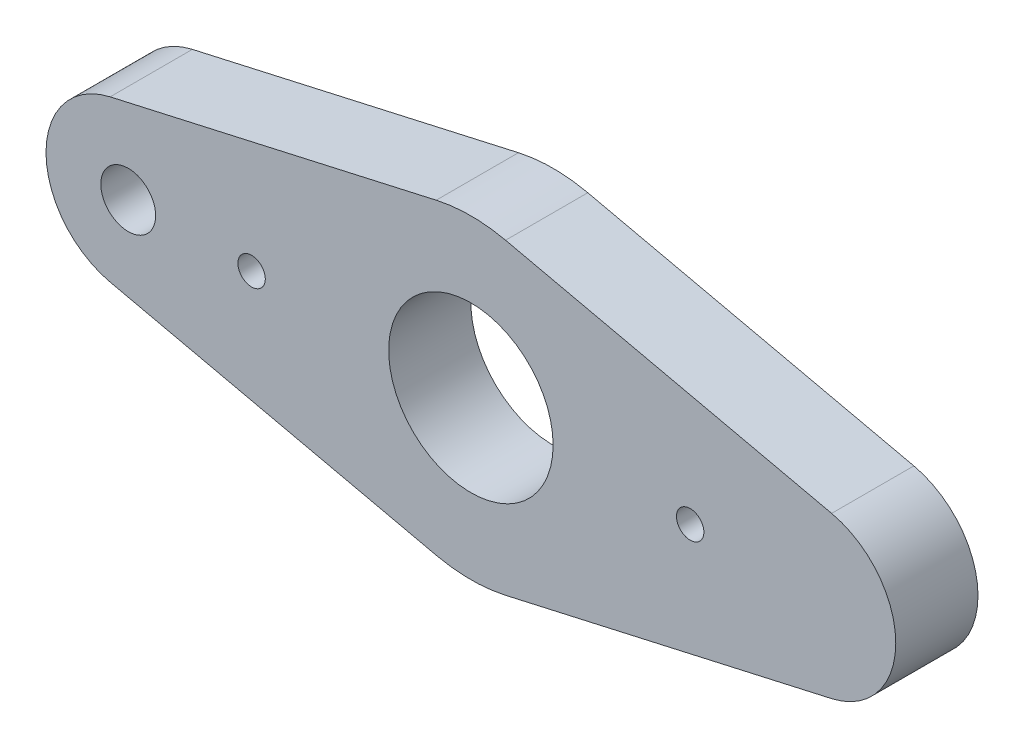
ISO-10303-21;
HEADER;
FILE_DESCRIPTION(('STEP AP214'),'2;1');
FILE_NAME('part.step','',(''),(''),'','','');
FILE_SCHEMA(('AUTOMOTIVE_DESIGN { 1 0 10303 214 1 1 1 1 }'));
ENDSEC;
DATA;
#1=APPLICATION_CONTEXT('core data for automotive mechanical design processes');
#2=APPLICATION_PROTOCOL_DEFINITION('international standard','automotive_design',2000,#1);
#3=PRODUCT_CONTEXT('',#1,'mechanical');
#4=PRODUCT('Part','Part','',(#3));
#5=PRODUCT_RELATED_PRODUCT_CATEGORY('part','',(#4));
#6=PRODUCT_DEFINITION_FORMATION('','',#4);
#7=PRODUCT_DEFINITION_CONTEXT('part definition',#1,'design');
#8=PRODUCT_DEFINITION('design','',#6,#7);
#9=PRODUCT_DEFINITION_SHAPE('','',#8);
#10=(LENGTH_UNIT() NAMED_UNIT(*) SI_UNIT(.MILLI.,.METRE.));
#11=(NAMED_UNIT(*) PLANE_ANGLE_UNIT() SI_UNIT($,.RADIAN.));
#12=(NAMED_UNIT(*) SI_UNIT($,.STERADIAN.) SOLID_ANGLE_UNIT());
#13=UNCERTAINTY_MEASURE_WITH_UNIT(LENGTH_MEASURE(1.E-05),#10,'distance_accuracy_value','');
#14=(GEOMETRIC_REPRESENTATION_CONTEXT(3) GLOBAL_UNCERTAINTY_ASSIGNED_CONTEXT((#13)) GLOBAL_UNIT_ASSIGNED_CONTEXT((#10,
#11,#12)) REPRESENTATION_CONTEXT('',''));
#15=CARTESIAN_POINT('',(0.,0.,0.));
#16=DIRECTION('',(0.,0.,1.));
#17=DIRECTION('',(1.,0.,0.));
#18=AXIS2_PLACEMENT_3D('',#15,#16,#17);
#19=CARTESIAN_POINT('',(-25.,0.,6.));
#20=DIRECTION('',(0.,0.,1.));
#21=DIRECTION('',(1.,0.,0.));
#22=AXIS2_PLACEMENT_3D('',#19,#20,#21);
#23=PLANE('',#22);
#24=CARTESIAN_POINT('',(-25.,0.,6.));
#25=DIRECTION('',(0.,0.,1.));
#26=DIRECTION('',(1.,0.,0.));
#27=AXIS2_PLACEMENT_3D('',#24,#25,#26);
#28=CIRCLE('',#27,2.);
#29=CARTESIAN_POINT('',(-23.,0.,6.));
#30=VERTEX_POINT('',#29);
#31=EDGE_CURVE('E188',#30,#30,#28,.T.);
#32=ORIENTED_EDGE('',*,*,#31,.F.);
#33=EDGE_LOOP('',(#32));
#34=FACE_BOUND('',#33,.T.);
#35=CARTESIAN_POINT('',(0.,0.,6.));
#36=DIRECTION('',(0.,0.,1.));
#37=DIRECTION('',(1.,0.,0.));
#38=AXIS2_PLACEMENT_3D('',#35,#36,#37);
#39=CIRCLE('',#38,6.);
#40=CARTESIAN_POINT('',(6.,0.,6.));
#41=VERTEX_POINT('',#40);
#42=EDGE_CURVE('E134',#41,#41,#39,.T.);
#43=ORIENTED_EDGE('',*,*,#42,.F.);
#44=EDGE_LOOP('',(#43));
#45=FACE_BOUND('',#44,.T.);
#46=CARTESIAN_POINT('',(-25.,0.,6.));
#47=DIRECTION('',(0.,0.,1.));
#48=DIRECTION('',(1.,0.,0.));
#49=AXIS2_PLACEMENT_3D('',#46,#47,#48);
#50=CIRCLE('',#49,6.);
#51=CARTESIAN_POINT('',(-26.32,5.85299923116346,6.));
#52=VERTEX_POINT('',#51);
#53=CARTESIAN_POINT('',(-26.32,-5.85299923116346,6.));
#54=VERTEX_POINT('',#53);
#55=EDGE_CURVE('E145',#52,#54,#50,.T.);
#56=ORIENTED_EDGE('',*,*,#55,.T.);
#57=DIRECTION('',(0.975499871860576,-0.22,0.));
#58=VECTOR('',#57,1.);
#59=CARTESIAN_POINT('',(-26.32,-5.85299923116346,6.));
#60=LINE('',#59,#58);
#61=CARTESIAN_POINT('',(-2.53,-11.2182485263966,6.));
#62=VERTEX_POINT('',#61);
#63=EDGE_CURVE('E93',#54,#62,#60,.T.);
#64=ORIENTED_EDGE('',*,*,#63,.T.);
#65=CARTESIAN_POINT('',(0.,0.,6.));
#66=DIRECTION('',(0.,0.,1.));
#67=DIRECTION('',(1.,0.,0.));
#68=AXIS2_PLACEMENT_3D('',#65,#66,#67);
#69=CIRCLE('',#68,11.5);
#70=CARTESIAN_POINT('',(2.53,-11.2182485263966,6.));
#71=VERTEX_POINT('',#70);
#72=EDGE_CURVE('E160',#62,#71,#69,.T.);
#73=ORIENTED_EDGE('',*,*,#72,.T.);
#74=DIRECTION('',(0.975499871860576,0.22,0.));
#75=VECTOR('',#74,1.);
#76=CARTESIAN_POINT('',(26.32,-5.85299923116346,6.));
#77=LINE('',#76,#75);
#78=CARTESIAN_POINT('',(26.32,-5.85299923116346,6.));
#79=VERTEX_POINT('',#78);
#80=EDGE_CURVE('E173',#71,#79,#77,.T.);
#81=ORIENTED_EDGE('',*,*,#80,.T.);
#82=CARTESIAN_POINT('',(25.,0.,6.));
#83=DIRECTION('',(0.,0.,1.));
#84=DIRECTION('',(-1.,0.,0.));
#85=AXIS2_PLACEMENT_3D('',#82,#83,#84);
#86=CIRCLE('',#85,6.);
#87=CARTESIAN_POINT('',(26.32,5.85299923116346,6.));
#88=VERTEX_POINT('',#87);
#89=EDGE_CURVE('E112',#79,#88,#86,.T.);
#90=ORIENTED_EDGE('',*,*,#89,.T.);
#91=DIRECTION('',(-0.975499871860576,0.22,0.));
#92=VECTOR('',#91,1.);
#93=CARTESIAN_POINT('',(26.32,5.85299923116346,6.));
#94=LINE('',#93,#92);
#95=CARTESIAN_POINT('',(2.53,11.2182485263966,6.));
#96=VERTEX_POINT('',#95);
#97=EDGE_CURVE('E106',#88,#96,#94,.T.);
#98=ORIENTED_EDGE('',*,*,#97,.T.);
#99=CARTESIAN_POINT('',(0.,0.,6.));
#100=DIRECTION('',(0.,0.,1.));
#101=DIRECTION('',(-1.,0.,0.));
#102=AXIS2_PLACEMENT_3D('',#99,#100,#101);
#103=CIRCLE('',#102,11.5);
#104=CARTESIAN_POINT('',(-2.53,11.2182485263966,6.));
#105=VERTEX_POINT('',#104);
#106=EDGE_CURVE('E110',#96,#105,#103,.T.);
#107=ORIENTED_EDGE('',*,*,#106,.T.);
#108=DIRECTION('',(-0.975499871860576,-0.22,0.));
#109=VECTOR('',#108,1.);
#110=CARTESIAN_POINT('',(-26.32,5.85299923116346,6.));
#111=LINE('',#110,#109);
#112=EDGE_CURVE('E50',#105,#52,#111,.T.);
#113=ORIENTED_EDGE('',*,*,#112,.T.);
#114=EDGE_LOOP('',(#56,#64,#73,#81,#90,#98,#107,#113));
#115=FACE_BOUND('',#114,.T.);
#116=CARTESIAN_POINT('',(-16.,0.,6.));
#117=DIRECTION('',(0.,0.,1.));
#118=DIRECTION('',(1.,0.,0.));
#119=AXIS2_PLACEMENT_3D('',#116,#117,#118);
#120=CIRCLE('',#119,1.);
#121=CARTESIAN_POINT('',(-15.,0.,6.));
#122=VERTEX_POINT('',#121);
#123=EDGE_CURVE('E182',#122,#122,#120,.T.);
#124=ORIENTED_EDGE('',*,*,#123,.F.);
#125=EDGE_LOOP('',(#124));
#126=FACE_BOUND('',#125,.T.);
#127=CARTESIAN_POINT('',(16.,0.,6.));
#128=DIRECTION('',(0.,0.,1.));
#129=DIRECTION('',(-1.,0.,0.));
#130=AXIS2_PLACEMENT_3D('',#127,#128,#129);
#131=CIRCLE('',#130,1.);
#132=CARTESIAN_POINT('',(15.,0.,6.));
#133=VERTEX_POINT('',#132);
#134=EDGE_CURVE('E194',#133,#133,#131,.T.);
#135=ORIENTED_EDGE('',*,*,#134,.F.);
#136=EDGE_LOOP('',(#135));
#137=FACE_BOUND('',#136,.T.);
#138=ADVANCED_FACE('F33',(#34,#45,#115,#126,#137),#23,.T.);
#139=CARTESIAN_POINT('',(-25.,0.,0.));
#140=DIRECTION('',(0.,0.,1.));
#141=DIRECTION('',(1.,0.,0.));
#142=AXIS2_PLACEMENT_3D('',#139,#140,#141);
#143=PLANE('',#142);
#144=CARTESIAN_POINT('',(-25.,0.,0.));
#145=DIRECTION('',(0.,0.,1.));
#146=DIRECTION('',(1.,0.,0.));
#147=AXIS2_PLACEMENT_3D('',#144,#145,#146);
#148=CIRCLE('',#147,6.);
#149=CARTESIAN_POINT('',(-26.32,5.85299923116346,0.));
#150=VERTEX_POINT('',#149);
#151=CARTESIAN_POINT('',(-26.32,-5.85299923116346,0.));
#152=VERTEX_POINT('',#151);
#153=EDGE_CURVE('E130',#150,#152,#148,.T.);
#154=ORIENTED_EDGE('',*,*,#153,.F.);
#155=DIRECTION('',(-0.975499871860576,-0.22,0.));
#156=VECTOR('',#155,1.);
#157=CARTESIAN_POINT('',(-26.32,5.85299923116346,0.));
#158=LINE('',#157,#156);
#159=CARTESIAN_POINT('',(-2.53,11.2182485263966,0.));
#160=VERTEX_POINT('',#159);
#161=EDGE_CURVE('E85',#160,#150,#158,.T.);
#162=ORIENTED_EDGE('',*,*,#161,.F.);
#163=CARTESIAN_POINT('',(0.,0.,0.));
#164=DIRECTION('',(0.,0.,1.));
#165=DIRECTION('',(-1.,0.,0.));
#166=AXIS2_PLACEMENT_3D('',#163,#164,#165);
#167=CIRCLE('',#166,11.5);
#168=CARTESIAN_POINT('',(2.53,11.2182485263966,0.));
#169=VERTEX_POINT('',#168);
#170=EDGE_CURVE('E79',#169,#160,#167,.T.);
#171=ORIENTED_EDGE('',*,*,#170,.F.);
#172=DIRECTION('',(-0.975499871860576,0.22,0.));
#173=VECTOR('',#172,1.);
#174=CARTESIAN_POINT('',(26.32,5.85299923116346,0.));
#175=LINE('',#174,#173);
#176=CARTESIAN_POINT('',(26.32,5.85299923116346,0.));
#177=VERTEX_POINT('',#176);
#178=EDGE_CURVE('E120',#177,#169,#175,.T.);
#179=ORIENTED_EDGE('',*,*,#178,.F.);
#180=CARTESIAN_POINT('',(25.,0.,0.));
#181=DIRECTION('',(0.,0.,1.));
#182=DIRECTION('',(-1.,0.,0.));
#183=AXIS2_PLACEMENT_3D('',#180,#181,#182);
#184=CIRCLE('',#183,6.);
#185=CARTESIAN_POINT('',(26.32,-5.85299923116346,0.));
#186=VERTEX_POINT('',#185);
#187=EDGE_CURVE('E140',#186,#177,#184,.T.);
#188=ORIENTED_EDGE('',*,*,#187,.F.);
#189=DIRECTION('',(0.975499871860576,0.22,0.));
#190=VECTOR('',#189,1.);
#191=CARTESIAN_POINT('',(26.32,-5.85299923116346,0.));
#192=LINE('',#191,#190);
#193=CARTESIAN_POINT('',(2.53,-11.2182485263966,0.));
#194=VERTEX_POINT('',#193);
#195=EDGE_CURVE('E138',#194,#186,#192,.T.);
#196=ORIENTED_EDGE('',*,*,#195,.F.);
#197=CARTESIAN_POINT('',(0.,0.,0.));
#198=DIRECTION('',(0.,0.,1.));
#199=DIRECTION('',(1.,0.,0.));
#200=AXIS2_PLACEMENT_3D('',#197,#198,#199);
#201=CIRCLE('',#200,11.5);
#202=CARTESIAN_POINT('',(-2.53,-11.2182485263966,0.));
#203=VERTEX_POINT('',#202);
#204=EDGE_CURVE('E136',#203,#194,#201,.T.);
#205=ORIENTED_EDGE('',*,*,#204,.F.);
#206=DIRECTION('',(0.975499871860576,-0.22,0.));
#207=VECTOR('',#206,1.);
#208=CARTESIAN_POINT('',(-26.32,-5.85299923116346,0.));
#209=LINE('',#208,#207);
#210=EDGE_CURVE('E133',#152,#203,#209,.T.);
#211=ORIENTED_EDGE('',*,*,#210,.F.);
#212=EDGE_LOOP('',(#154,#162,#171,#179,#188,#196,#205,#211));
#213=FACE_BOUND('',#212,.T.);
#214=CARTESIAN_POINT('',(0.,0.,0.));
#215=DIRECTION('',(0.,0.,1.));
#216=DIRECTION('',(1.,0.,0.));
#217=AXIS2_PLACEMENT_3D('',#214,#215,#216);
#218=CIRCLE('',#217,6.);
#219=CARTESIAN_POINT('',(6.,0.,0.));
#220=VERTEX_POINT('',#219);
#221=EDGE_CURVE('E179',#220,#220,#218,.T.);
#222=ORIENTED_EDGE('',*,*,#221,.T.);
#223=EDGE_LOOP('',(#222));
#224=FACE_BOUND('',#223,.T.);
#225=CARTESIAN_POINT('',(-16.,0.,0.));
#226=DIRECTION('',(0.,0.,1.));
#227=DIRECTION('',(1.,0.,0.));
#228=AXIS2_PLACEMENT_3D('',#225,#226,#227);
#229=CIRCLE('',#228,1.);
#230=CARTESIAN_POINT('',(-15.,0.,0.));
#231=VERTEX_POINT('',#230);
#232=EDGE_CURVE('E185',#231,#231,#229,.T.);
#233=ORIENTED_EDGE('',*,*,#232,.T.);
#234=EDGE_LOOP('',(#233));
#235=FACE_BOUND('',#234,.T.);
#236=CARTESIAN_POINT('',(-25.,0.,0.));
#237=DIRECTION('',(0.,0.,1.));
#238=DIRECTION('',(1.,0.,0.));
#239=AXIS2_PLACEMENT_3D('',#236,#237,#238);
#240=CIRCLE('',#239,2.);
#241=CARTESIAN_POINT('',(-23.,0.,0.));
#242=VERTEX_POINT('',#241);
#243=EDGE_CURVE('E191',#242,#242,#240,.T.);
#244=ORIENTED_EDGE('',*,*,#243,.T.);
#245=EDGE_LOOP('',(#244));
#246=FACE_BOUND('',#245,.T.);
#247=CARTESIAN_POINT('',(16.,0.,0.));
#248=DIRECTION('',(0.,0.,1.));
#249=DIRECTION('',(-1.,0.,0.));
#250=AXIS2_PLACEMENT_3D('',#247,#248,#249);
#251=CIRCLE('',#250,1.);
#252=CARTESIAN_POINT('',(15.,0.,0.));
#253=VERTEX_POINT('',#252);
#254=EDGE_CURVE('E197',#253,#253,#251,.T.);
#255=ORIENTED_EDGE('',*,*,#254,.T.);
#256=EDGE_LOOP('',(#255));
#257=FACE_BOUND('',#256,.T.);
#258=ADVANCED_FACE('F164',(#213,#224,#235,#246,#257),#143,.F.);
#259=CARTESIAN_POINT('',(-25.,0.,6.));
#260=DIRECTION('',(0.,0.,-1.));
#261=DIRECTION('',(-1.,0.,0.));
#262=AXIS2_PLACEMENT_3D('',#259,#260,#261);
#263=CYLINDRICAL_SURFACE('',#262,6.);
#264=ORIENTED_EDGE('',*,*,#153,.T.);
#265=DIRECTION('',(0.,0.,-1.));
#266=VECTOR('',#265,1.);
#267=CARTESIAN_POINT('',(-26.32,-5.85299923116346,6.));
#268=LINE('',#267,#266);
#269=EDGE_CURVE('E11',#54,#152,#268,.T.);
#270=ORIENTED_EDGE('',*,*,#269,.F.);
#271=ORIENTED_EDGE('',*,*,#55,.F.);
#272=DIRECTION('',(0.,0.,-1.));
#273=VECTOR('',#272,1.);
#274=CARTESIAN_POINT('',(-26.32,5.85299923116346,6.));
#275=LINE('',#274,#273);
#276=EDGE_CURVE('E126',#52,#150,#275,.T.);
#277=ORIENTED_EDGE('',*,*,#276,.T.);
#278=EDGE_LOOP('',(#264,#270,#271,#277));
#279=FACE_BOUND('',#278,.T.);
#280=ADVANCED_FACE('F35',(#279),#263,.T.);
#281=CARTESIAN_POINT('',(-26.32,-5.85299923116346,6.));
#282=DIRECTION('',(0.22,0.975499871860576,0.));
#283=DIRECTION('',(-0.975499871860576,0.22,0.));
#284=AXIS2_PLACEMENT_3D('',#281,#282,#283);
#285=PLANE('',#284);
#286=ORIENTED_EDGE('',*,*,#210,.T.);
#287=DIRECTION('',(0.,0.,-1.));
#288=VECTOR('',#287,1.);
#289=CARTESIAN_POINT('',(-2.53,-11.2182485263966,6.));
#290=LINE('',#289,#288);
#291=EDGE_CURVE('E42',#62,#203,#290,.T.);
#292=ORIENTED_EDGE('',*,*,#291,.F.);
#293=ORIENTED_EDGE('',*,*,#63,.F.);
#294=ORIENTED_EDGE('',*,*,#269,.T.);
#295=EDGE_LOOP('',(#286,#292,#293,#294));
#296=FACE_BOUND('',#295,.T.);
#297=ADVANCED_FACE('F231',(#296),#285,.F.);
#298=CARTESIAN_POINT('',(0.,0.,6.));
#299=DIRECTION('',(0.,0.,-1.));
#300=DIRECTION('',(-1.,0.,0.));
#301=AXIS2_PLACEMENT_3D('',#298,#299,#300);
#302=CYLINDRICAL_SURFACE('',#301,11.5);
#303=ORIENTED_EDGE('',*,*,#204,.T.);
#304=DIRECTION('',(0.,0.,-1.));
#305=VECTOR('',#304,1.);
#306=CARTESIAN_POINT('',(2.53,-11.2182485263966,6.));
#307=LINE('',#306,#305);
#308=EDGE_CURVE('E152',#71,#194,#307,.T.);
#309=ORIENTED_EDGE('',*,*,#308,.F.);
#310=ORIENTED_EDGE('',*,*,#72,.F.);
#311=ORIENTED_EDGE('',*,*,#291,.T.);
#312=EDGE_LOOP('',(#303,#309,#310,#311));
#313=FACE_BOUND('',#312,.T.);
#314=ADVANCED_FACE('F158',(#313),#302,.T.);
#315=CARTESIAN_POINT('',(26.32,-5.85299923116346,6.));
#316=DIRECTION('',(-0.22,0.975499871860576,0.));
#317=DIRECTION('',(-0.975499871860576,-0.22,0.));
#318=AXIS2_PLACEMENT_3D('',#315,#316,#317);
#319=PLANE('',#318);
#320=ORIENTED_EDGE('',*,*,#195,.T.);
#321=DIRECTION('',(0.,0.,-1.));
#322=VECTOR('',#321,1.);
#323=CARTESIAN_POINT('',(26.32,-5.85299923116346,6.));
#324=LINE('',#323,#322);
#325=EDGE_CURVE('E149',#79,#186,#324,.T.);
#326=ORIENTED_EDGE('',*,*,#325,.F.);
#327=ORIENTED_EDGE('',*,*,#80,.F.);
#328=ORIENTED_EDGE('',*,*,#308,.T.);
#329=EDGE_LOOP('',(#320,#326,#327,#328));
#330=FACE_BOUND('',#329,.T.);
#331=ADVANCED_FACE('F169',(#330),#319,.F.);
#332=CARTESIAN_POINT('',(25.,0.,6.));
#333=DIRECTION('',(0.,0.,-1.));
#334=DIRECTION('',(-1.,0.,0.));
#335=AXIS2_PLACEMENT_3D('',#332,#333,#334);
#336=CYLINDRICAL_SURFACE('',#335,6.);
#337=ORIENTED_EDGE('',*,*,#187,.T.);
#338=DIRECTION('',(0.,0.,-1.));
#339=VECTOR('',#338,1.);
#340=CARTESIAN_POINT('',(26.32,5.85299923116346,6.));
#341=LINE('',#340,#339);
#342=EDGE_CURVE('E121',#88,#177,#341,.T.);
#343=ORIENTED_EDGE('',*,*,#342,.F.);
#344=ORIENTED_EDGE('',*,*,#89,.F.);
#345=ORIENTED_EDGE('',*,*,#325,.T.);
#346=EDGE_LOOP('',(#337,#343,#344,#345));
#347=FACE_BOUND('',#346,.T.);
#348=ADVANCED_FACE('F172',(#347),#336,.T.);
#349=CARTESIAN_POINT('',(26.32,5.85299923116346,6.));
#350=DIRECTION('',(-0.22,-0.975499871860576,0.));
#351=DIRECTION('',(0.975499871860576,-0.22,0.));
#352=AXIS2_PLACEMENT_3D('',#349,#350,#351);
#353=PLANE('',#352);
#354=ORIENTED_EDGE('',*,*,#178,.T.);
#355=DIRECTION('',(0.,0.,-1.));
#356=VECTOR('',#355,1.);
#357=CARTESIAN_POINT('',(2.53,11.2182485263966,6.));
#358=LINE('',#357,#356);
#359=EDGE_CURVE('E117',#96,#169,#358,.T.);
#360=ORIENTED_EDGE('',*,*,#359,.F.);
#361=ORIENTED_EDGE('',*,*,#97,.F.);
#362=ORIENTED_EDGE('',*,*,#342,.T.);
#363=EDGE_LOOP('',(#354,#360,#361,#362));
#364=FACE_BOUND('',#363,.T.);
#365=ADVANCED_FACE('F118',(#364),#353,.F.);
#366=CARTESIAN_POINT('',(0.,0.,6.));
#367=DIRECTION('',(0.,0.,-1.));
#368=DIRECTION('',(-1.,0.,0.));
#369=AXIS2_PLACEMENT_3D('',#366,#367,#368);
#370=CYLINDRICAL_SURFACE('',#369,11.5);
#371=ORIENTED_EDGE('',*,*,#170,.T.);
#372=DIRECTION('',(0.,0.,-1.));
#373=VECTOR('',#372,1.);
#374=CARTESIAN_POINT('',(-2.53,11.2182485263966,6.));
#375=LINE('',#374,#373);
#376=EDGE_CURVE('E122',#105,#160,#375,.T.);
#377=ORIENTED_EDGE('',*,*,#376,.F.);
#378=ORIENTED_EDGE('',*,*,#106,.F.);
#379=ORIENTED_EDGE('',*,*,#359,.T.);
#380=EDGE_LOOP('',(#371,#377,#378,#379));
#381=FACE_BOUND('',#380,.T.);
#382=ADVANCED_FACE('F124',(#381),#370,.T.);
#383=CARTESIAN_POINT('',(-26.32,5.85299923116346,6.));
#384=DIRECTION('',(0.22,-0.975499871860576,0.));
#385=DIRECTION('',(0.975499871860576,0.22,0.));
#386=AXIS2_PLACEMENT_3D('',#383,#384,#385);
#387=PLANE('',#386);
#388=ORIENTED_EDGE('',*,*,#161,.T.);
#389=ORIENTED_EDGE('',*,*,#276,.F.);
#390=ORIENTED_EDGE('',*,*,#112,.F.);
#391=ORIENTED_EDGE('',*,*,#376,.T.);
#392=EDGE_LOOP('',(#388,#389,#390,#391));
#393=FACE_BOUND('',#392,.T.);
#394=ADVANCED_FACE('F219',(#393),#387,.F.);
#395=CARTESIAN_POINT('',(0.,0.,6.));
#396=DIRECTION('',(0.,0.,-1.));
#397=DIRECTION('',(-1.,0.,0.));
#398=AXIS2_PLACEMENT_3D('',#395,#396,#397);
#399=CYLINDRICAL_SURFACE('',#398,6.);
#400=ORIENTED_EDGE('',*,*,#42,.T.);
#401=EDGE_LOOP('',(#400));
#402=FACE_BOUND('',#401,.T.);
#403=ORIENTED_EDGE('',*,*,#221,.F.);
#404=EDGE_LOOP('',(#403));
#405=FACE_BOUND('',#404,.T.);
#406=ADVANCED_FACE('F216',(#402,#405),#399,.F.);
#407=CARTESIAN_POINT('',(-16.,0.,6.));
#408=DIRECTION('',(0.,0.,-1.));
#409=DIRECTION('',(-1.,0.,0.));
#410=AXIS2_PLACEMENT_3D('',#407,#408,#409);
#411=CYLINDRICAL_SURFACE('',#410,1.);
#412=ORIENTED_EDGE('',*,*,#123,.T.);
#413=EDGE_LOOP('',(#412));
#414=FACE_BOUND('',#413,.T.);
#415=ORIENTED_EDGE('',*,*,#232,.F.);
#416=EDGE_LOOP('',(#415));
#417=FACE_BOUND('',#416,.T.);
#418=ADVANCED_FACE('F295',(#414,#417),#411,.F.);
#419=CARTESIAN_POINT('',(-25.,0.,6.));
#420=DIRECTION('',(0.,0.,-1.));
#421=DIRECTION('',(-1.,0.,0.));
#422=AXIS2_PLACEMENT_3D('',#419,#420,#421);
#423=CYLINDRICAL_SURFACE('',#422,2.);
#424=ORIENTED_EDGE('',*,*,#31,.T.);
#425=EDGE_LOOP('',(#424));
#426=FACE_BOUND('',#425,.T.);
#427=ORIENTED_EDGE('',*,*,#243,.F.);
#428=EDGE_LOOP('',(#427));
#429=FACE_BOUND('',#428,.T.);
#430=ADVANCED_FACE('F303',(#426,#429),#423,.F.);
#431=CARTESIAN_POINT('',(16.,0.,6.));
#432=DIRECTION('',(0.,0.,-1.));
#433=DIRECTION('',(-1.,0.,0.));
#434=AXIS2_PLACEMENT_3D('',#431,#432,#433);
#435=CYLINDRICAL_SURFACE('',#434,1.);
#436=ORIENTED_EDGE('',*,*,#134,.T.);
#437=EDGE_LOOP('',(#436));
#438=FACE_BOUND('',#437,.T.);
#439=ORIENTED_EDGE('',*,*,#254,.F.);
#440=EDGE_LOOP('',(#439));
#441=FACE_BOUND('',#440,.T.);
#442=ADVANCED_FACE('F203',(#438,#441),#435,.F.);
#443=CLOSED_SHELL('',(#138,#258,#280,#297,#314,#331,#348,#365,#382,#394,#406,#418,#430,#442));
#444=MANIFOLD_SOLID_BREP('B2',#443);
#445=ADVANCED_BREP_SHAPE_REPRESENTATION('',(#18,#444),#14);
#446=SHAPE_DEFINITION_REPRESENTATION(#9,#445);
ENDSEC;
END-ISO-10303-21;
